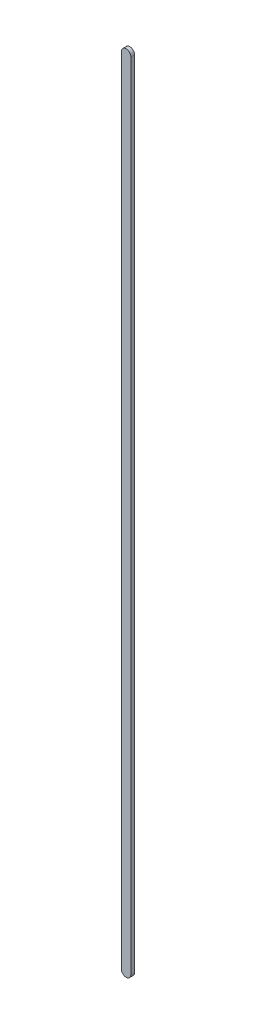
ISO-10303-21;
HEADER;
FILE_DESCRIPTION(('STEP AP214'),'2;1');
FILE_NAME('part.step','',(''),(''),'','','');
FILE_SCHEMA(('AUTOMOTIVE_DESIGN { 1 0 10303 214 1 1 1 1 }'));
ENDSEC;
DATA;
#1=APPLICATION_CONTEXT('core data for automotive mechanical design processes');
#2=APPLICATION_PROTOCOL_DEFINITION('international standard','automotive_design',2000,#1);
#3=PRODUCT_CONTEXT('',#1,'mechanical');
#4=PRODUCT('Part','Part','',(#3));
#5=PRODUCT_RELATED_PRODUCT_CATEGORY('part','',(#4));
#6=PRODUCT_DEFINITION_FORMATION('','',#4);
#7=PRODUCT_DEFINITION_CONTEXT('part definition',#1,'design');
#8=PRODUCT_DEFINITION('design','',#6,#7);
#9=PRODUCT_DEFINITION_SHAPE('','',#8);
#10=(LENGTH_UNIT() NAMED_UNIT(*) SI_UNIT(.MILLI.,.METRE.));
#11=(NAMED_UNIT(*) PLANE_ANGLE_UNIT() SI_UNIT($,.RADIAN.));
#12=(NAMED_UNIT(*) SI_UNIT($,.STERADIAN.) SOLID_ANGLE_UNIT());
#13=UNCERTAINTY_MEASURE_WITH_UNIT(LENGTH_MEASURE(1.E-05),#10,'distance_accuracy_value','');
#14=(GEOMETRIC_REPRESENTATION_CONTEXT(3) GLOBAL_UNCERTAINTY_ASSIGNED_CONTEXT((#13)) GLOBAL_UNIT_ASSIGNED_CONTEXT((#10,
#11,#12)) REPRESENTATION_CONTEXT('',''));
#15=CARTESIAN_POINT('',(0.,0.,0.));
#16=DIRECTION('',(0.,0.,1.));
#17=DIRECTION('',(1.,0.,0.));
#18=AXIS2_PLACEMENT_3D('',#15,#16,#17);
#19=CARTESIAN_POINT('',(146.6953632,64.809624,0.));
#20=DIRECTION('',(-1.,0.,0.));
#21=DIRECTION('',(0.,1.,0.));
#22=AXIS2_PLACEMENT_3D('',#19,#20,#21);
#23=PLANE('',#22);
#24=DIRECTION('',(0.,1.,0.));
#25=VECTOR('',#24,1.);
#26=CARTESIAN_POINT('',(146.6953632,64.809624,0.1999996));
#27=LINE('',#26,#25);
#28=CARTESIAN_POINT('',(146.6953632,64.809624,0.1999996));
#29=VERTEX_POINT('',#28);
#30=CARTESIAN_POINT('',(146.6953632,107.5285632,0.1999996));
#31=VERTEX_POINT('',#30);
#32=EDGE_CURVE('E11',#29,#31,#27,.T.);
#33=ORIENTED_EDGE('',*,*,#32,.F.);
#34=DIRECTION('',(0.,0.,1.));
#35=VECTOR('',#34,1.);
#36=CARTESIAN_POINT('',(146.6953632,64.809624,0.));
#37=LINE('',#36,#35);
#38=CARTESIAN_POINT('',(146.6953632,64.809624,0.));
#39=VERTEX_POINT('',#38);
#40=EDGE_CURVE('E24',#39,#29,#37,.T.);
#41=ORIENTED_EDGE('',*,*,#40,.F.);
#42=DIRECTION('',(0.,1.,0.));
#43=VECTOR('',#42,1.);
#44=CARTESIAN_POINT('',(146.6953632,64.809624,0.));
#45=LINE('',#44,#43);
#46=CARTESIAN_POINT('',(146.6953632,107.5285632,0.));
#47=VERTEX_POINT('',#46);
#48=EDGE_CURVE('E75',#39,#47,#45,.T.);
#49=ORIENTED_EDGE('',*,*,#48,.T.);
#50=DIRECTION('',(0.,0.,1.));
#51=VECTOR('',#50,1.);
#52=CARTESIAN_POINT('',(146.6953632,107.5285632,0.));
#53=LINE('',#52,#51);
#54=EDGE_CURVE('E37',#47,#31,#53,.T.);
#55=ORIENTED_EDGE('',*,*,#54,.T.);
#56=EDGE_LOOP('',(#33,#41,#49,#55));
#57=FACE_BOUND('',#56,.T.);
#58=ADVANCED_FACE('F17',(#57),#23,.F.);
#59=CARTESIAN_POINT('',(146.4413632,107.5285632,0.));
#60=DIRECTION('',(0.,0.,-1.));
#61=DIRECTION('',(1.,0.,0.));
#62=AXIS2_PLACEMENT_3D('',#59,#60,#61);
#63=CYLINDRICAL_SURFACE('',#62,0.25400000000001);
#64=CARTESIAN_POINT('',(146.4413632,107.5285632,0.1999996));
#65=DIRECTION('',(0.,0.,1.));
#66=DIRECTION('',(1.,0.,0.));
#67=AXIS2_PLACEMENT_3D('',#64,#65,#66);
#68=CIRCLE('',#67,0.25400000000001);
#69=CARTESIAN_POINT('',(146.1873632,107.5285632,0.1999996));
#70=VERTEX_POINT('',#69);
#71=EDGE_CURVE('E83',#31,#70,#68,.T.);
#72=ORIENTED_EDGE('',*,*,#71,.F.);
#73=ORIENTED_EDGE('',*,*,#54,.F.);
#74=CARTESIAN_POINT('',(146.4413632,107.5285632,0.));
#75=DIRECTION('',(0.,0.,1.));
#76=DIRECTION('',(1.,0.,0.));
#77=AXIS2_PLACEMENT_3D('',#74,#75,#76);
#78=CIRCLE('',#77,0.25400000000001);
#79=CARTESIAN_POINT('',(146.1873632,107.5285632,0.));
#80=VERTEX_POINT('',#79);
#81=EDGE_CURVE('E81',#47,#80,#78,.T.);
#82=ORIENTED_EDGE('',*,*,#81,.T.);
#83=DIRECTION('',(0.,0.,1.));
#84=VECTOR('',#83,1.);
#85=CARTESIAN_POINT('',(146.1873632,107.5285632,0.));
#86=LINE('',#85,#84);
#87=EDGE_CURVE('E67',#80,#70,#86,.T.);
#88=ORIENTED_EDGE('',*,*,#87,.T.);
#89=EDGE_LOOP('',(#72,#73,#82,#88));
#90=FACE_BOUND('',#89,.T.);
#91=ADVANCED_FACE('F89',(#90),#63,.T.);
#92=CARTESIAN_POINT('',(146.1873632,107.5285632,0.));
#93=DIRECTION('',(1.,0.,0.));
#94=DIRECTION('',(0.,-1.,0.));
#95=AXIS2_PLACEMENT_3D('',#92,#93,#94);
#96=PLANE('',#95);
#97=DIRECTION('',(0.,-1.,0.));
#98=VECTOR('',#97,1.);
#99=CARTESIAN_POINT('',(146.1873632,107.5285632,0.1999996));
#100=LINE('',#99,#98);
#101=CARTESIAN_POINT('',(146.1873632,64.809624,0.1999996));
#102=VERTEX_POINT('',#101);
#103=EDGE_CURVE('E71',#70,#102,#100,.T.);
#104=ORIENTED_EDGE('',*,*,#103,.F.);
#105=ORIENTED_EDGE('',*,*,#87,.F.);
#106=DIRECTION('',(0.,-1.,0.));
#107=VECTOR('',#106,1.);
#108=CARTESIAN_POINT('',(146.1873632,107.5285632,0.));
#109=LINE('',#108,#107);
#110=CARTESIAN_POINT('',(146.1873632,64.809624,0.));
#111=VERTEX_POINT('',#110);
#112=EDGE_CURVE('E63',#80,#111,#109,.T.);
#113=ORIENTED_EDGE('',*,*,#112,.T.);
#114=DIRECTION('',(0.,0.,1.));
#115=VECTOR('',#114,1.);
#116=CARTESIAN_POINT('',(146.1873632,64.809624,0.));
#117=LINE('',#116,#115);
#118=EDGE_CURVE('E53',#111,#102,#117,.T.);
#119=ORIENTED_EDGE('',*,*,#118,.T.);
#120=EDGE_LOOP('',(#104,#105,#113,#119));
#121=FACE_BOUND('',#120,.T.);
#122=ADVANCED_FACE('F66',(#121),#96,.F.);
#123=CARTESIAN_POINT('',(146.4413632,64.809624,0.));
#124=DIRECTION('',(0.,0.,-1.));
#125=DIRECTION('',(-1.,0.,0.));
#126=AXIS2_PLACEMENT_3D('',#123,#124,#125);
#127=CYLINDRICAL_SURFACE('',#126,0.25400000000001);
#128=CARTESIAN_POINT('',(146.4413632,64.809624,0.1999996));
#129=DIRECTION('',(0.,0.,1.));
#130=DIRECTION('',(-1.,0.,0.));
#131=AXIS2_PLACEMENT_3D('',#128,#129,#130);
#132=CIRCLE('',#131,0.25400000000001);
#133=EDGE_CURVE('E59',#102,#29,#132,.T.);
#134=ORIENTED_EDGE('',*,*,#133,.F.);
#135=ORIENTED_EDGE('',*,*,#118,.F.);
#136=CARTESIAN_POINT('',(146.4413632,64.809624,0.));
#137=DIRECTION('',(0.,0.,1.));
#138=DIRECTION('',(-1.,0.,0.));
#139=AXIS2_PLACEMENT_3D('',#136,#137,#138);
#140=CIRCLE('',#139,0.25400000000001);
#141=EDGE_CURVE('E57',#111,#39,#140,.T.);
#142=ORIENTED_EDGE('',*,*,#141,.T.);
#143=ORIENTED_EDGE('',*,*,#40,.T.);
#144=EDGE_LOOP('',(#134,#135,#142,#143));
#145=FACE_BOUND('',#144,.T.);
#146=ADVANCED_FACE('F55',(#145),#127,.T.);
#147=CARTESIAN_POINT('',(146.6953632,64.809624,0.));
#148=DIRECTION('',(0.,0.,-1.));
#149=DIRECTION('',(-1.,0.,0.));
#150=AXIS2_PLACEMENT_3D('',#147,#148,#149);
#151=PLANE('',#150);
#152=ORIENTED_EDGE('',*,*,#141,.F.);
#153=ORIENTED_EDGE('',*,*,#112,.F.);
#154=ORIENTED_EDGE('',*,*,#81,.F.);
#155=ORIENTED_EDGE('',*,*,#48,.F.);
#156=EDGE_LOOP('',(#152,#153,#154,#155));
#157=FACE_BOUND('',#156,.T.);
#158=ADVANCED_FACE('F74',(#157),#151,.T.);
#159=CARTESIAN_POINT('',(146.6953632,64.809624,0.1999996));
#160=DIRECTION('',(0.,0.,-1.));
#161=DIRECTION('',(-1.,0.,0.));
#162=AXIS2_PLACEMENT_3D('',#159,#160,#161);
#163=PLANE('',#162);
#164=ORIENTED_EDGE('',*,*,#32,.T.);
#165=ORIENTED_EDGE('',*,*,#71,.T.);
#166=ORIENTED_EDGE('',*,*,#103,.T.);
#167=ORIENTED_EDGE('',*,*,#133,.T.);
#168=EDGE_LOOP('',(#164,#165,#166,#167));
#169=FACE_BOUND('',#168,.T.);
#170=ADVANCED_FACE('F91',(#169),#163,.F.);
#171=CLOSED_SHELL('',(#58,#91,#122,#146,#158,#170));
#172=MANIFOLD_SOLID_BREP('B1',#171);
#173=ADVANCED_BREP_SHAPE_REPRESENTATION('',(#18,#172),#14);
#174=SHAPE_DEFINITION_REPRESENTATION(#9,#173);
ENDSEC;
END-ISO-10303-21;
